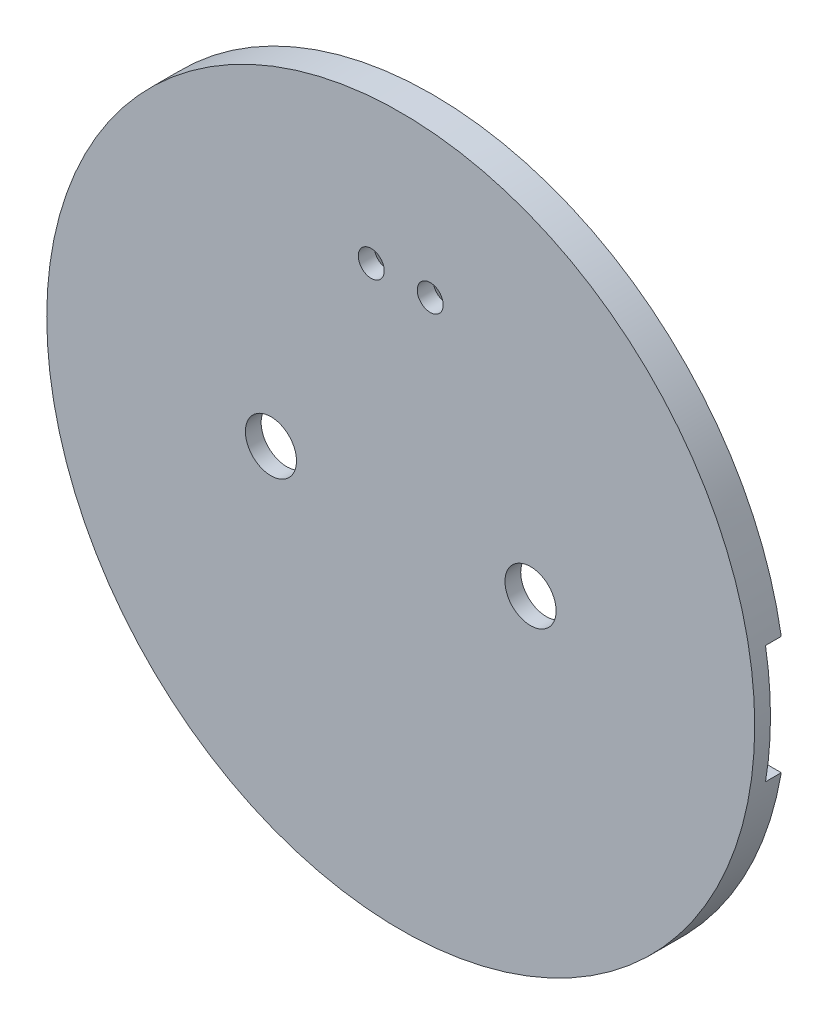
ISO-10303-21;
HEADER;
FILE_DESCRIPTION(('STEP AP214'),'2;1');
FILE_NAME('part.step','',(''),(''),'','','');
FILE_SCHEMA(('AUTOMOTIVE_DESIGN { 1 0 10303 214 1 1 1 1 }'));
ENDSEC;
DATA;
#1=APPLICATION_CONTEXT('core data for automotive mechanical design processes');
#2=APPLICATION_PROTOCOL_DEFINITION('international standard','automotive_design',2000,#1);
#3=PRODUCT_CONTEXT('',#1,'mechanical');
#4=PRODUCT('Part','Part','',(#3));
#5=PRODUCT_RELATED_PRODUCT_CATEGORY('part','',(#4));
#6=PRODUCT_DEFINITION_FORMATION('','',#4);
#7=PRODUCT_DEFINITION_CONTEXT('part definition',#1,'design');
#8=PRODUCT_DEFINITION('design','',#6,#7);
#9=PRODUCT_DEFINITION_SHAPE('','',#8);
#10=(LENGTH_UNIT() NAMED_UNIT(*) SI_UNIT(.MILLI.,.METRE.));
#11=(NAMED_UNIT(*) PLANE_ANGLE_UNIT() SI_UNIT($,.RADIAN.));
#12=(NAMED_UNIT(*) SI_UNIT($,.STERADIAN.) SOLID_ANGLE_UNIT());
#13=UNCERTAINTY_MEASURE_WITH_UNIT(LENGTH_MEASURE(1.E-05),#10,'distance_accuracy_value','');
#14=(GEOMETRIC_REPRESENTATION_CONTEXT(3) GLOBAL_UNCERTAINTY_ASSIGNED_CONTEXT((#13)) GLOBAL_UNIT_ASSIGNED_CONTEXT((#10,
#11,#12)) REPRESENTATION_CONTEXT('',''));
#15=CARTESIAN_POINT('',(0.,0.,0.));
#16=DIRECTION('',(0.,0.,1.));
#17=DIRECTION('',(1.,0.,0.));
#18=AXIS2_PLACEMENT_3D('',#15,#16,#17);
#19=CARTESIAN_POINT('',(0.,0.,0.));
#20=DIRECTION('',(0.,0.,1.));
#21=DIRECTION('',(1.,0.,0.));
#22=AXIS2_PLACEMENT_3D('',#19,#20,#21);
#23=PLANE('',#22);
#24=CARTESIAN_POINT('',(-7.49999999999285,52.9999999999995,0.));
#25=DIRECTION('',(0.,0.,-1.));
#26=DIRECTION('',(-1.,0.,0.));
#27=AXIS2_PLACEMENT_3D('',#24,#25,#26);
#28=CIRCLE('',#27,3.3);
#29=CARTESIAN_POINT('',(-10.7999999999929,52.9999999999995,0.));
#30=VERTEX_POINT('',#29);
#31=EDGE_CURVE('E180',#30,#30,#28,.T.);
#32=ORIENTED_EDGE('',*,*,#31,.T.);
#33=EDGE_LOOP('',(#32));
#34=FACE_BOUND('',#33,.T.);
#35=CARTESIAN_POINT('',(0.,0.,0.));
#36=DIRECTION('',(0.,0.,1.));
#37=DIRECTION('',(1.,0.,0.));
#38=AXIS2_PLACEMENT_3D('',#35,#36,#37);
#39=CIRCLE('',#38,90.);
#40=CARTESIAN_POINT('',(90.,0.,0.));
#41=VERTEX_POINT('',#40);
#42=EDGE_CURVE('E50',#41,#41,#39,.T.);
#43=ORIENTED_EDGE('',*,*,#42,.T.);
#44=EDGE_LOOP('',(#43));
#45=FACE_BOUND('',#44,.T.);
#46=CARTESIAN_POINT('',(32.9999999999839,-3.78169717762944E-11,0.));
#47=DIRECTION('',(0.,0.,-1.));
#48=DIRECTION('',(-1.,0.,0.));
#49=AXIS2_PLACEMENT_3D('',#46,#47,#48);
#50=CIRCLE('',#49,6.50000000001092);
#51=CARTESIAN_POINT('',(26.499999999973,-3.78169717762944E-11,0.));
#52=VERTEX_POINT('',#51);
#53=EDGE_CURVE('E191',#52,#52,#50,.T.);
#54=ORIENTED_EDGE('',*,*,#53,.T.);
#55=EDGE_LOOP('',(#54));
#56=FACE_BOUND('',#55,.T.);
#57=CARTESIAN_POINT('',(-33.0000000000161,-3.78308495641022E-11,0.));
#58=DIRECTION('',(0.,0.,-1.));
#59=DIRECTION('',(-1.,0.,0.));
#60=AXIS2_PLACEMENT_3D('',#57,#58,#59);
#61=CIRCLE('',#60,6.50000000001084);
#62=CARTESIAN_POINT('',(-39.500000000027,-3.78308495641022E-11,0.));
#63=VERTEX_POINT('',#62);
#64=EDGE_CURVE('E115',#63,#63,#61,.T.);
#65=ORIENTED_EDGE('',*,*,#64,.T.);
#66=EDGE_LOOP('',(#65));
#67=FACE_BOUND('',#66,.T.);
#68=CARTESIAN_POINT('',(7.50000000000715,52.9999999999995,0.));
#69=DIRECTION('',(0.,0.,-1.));
#70=DIRECTION('',(-1.,0.,0.));
#71=AXIS2_PLACEMENT_3D('',#68,#69,#70);
#72=CIRCLE('',#71,3.3);
#73=CARTESIAN_POINT('',(4.20000000000715,52.9999999999995,0.));
#74=VERTEX_POINT('',#73);
#75=EDGE_CURVE('E186',#74,#74,#72,.T.);
#76=ORIENTED_EDGE('',*,*,#75,.T.);
#77=EDGE_LOOP('',(#76));
#78=FACE_BOUND('',#77,.T.);
#79=ADVANCED_FACE('F43',(#34,#45,#56,#67,#78),#23,.T.);
#80=CARTESIAN_POINT('',(0.,0.,-8.));
#81=DIRECTION('',(0.,0.,1.));
#82=DIRECTION('',(1.,0.,0.));
#83=AXIS2_PLACEMENT_3D('',#80,#81,#82);
#84=PLANE('',#83);
#85=CARTESIAN_POINT('',(0.,0.,-8.));
#86=DIRECTION('',(0.,0.,1.));
#87=DIRECTION('',(1.,0.,0.));
#88=AXIS2_PLACEMENT_3D('',#85,#86,#87);
#89=CIRCLE('',#88,90.);
#90=CARTESIAN_POINT('',(-88.7411967464943,-15.,-8.));
#91=VERTEX_POINT('',#90);
#92=CARTESIAN_POINT('',(88.7411967464943,-15.,-8.));
#93=VERTEX_POINT('',#92);
#94=EDGE_CURVE('E55',#91,#93,#89,.T.);
#95=ORIENTED_EDGE('',*,*,#94,.F.);
#96=DIRECTION('',(-1.,0.,0.));
#97=VECTOR('',#96,1.);
#98=CARTESIAN_POINT('',(88.7411967464943,-15.,-8.));
#99=LINE('',#98,#97);
#100=EDGE_CURVE('E82',#93,#91,#99,.T.);
#101=ORIENTED_EDGE('',*,*,#100,.F.);
#102=EDGE_LOOP('',(#95,#101));
#103=FACE_BOUND('',#102,.T.);
#104=ADVANCED_FACE('F117',(#103),#84,.F.);
#105=CARTESIAN_POINT('',(0.,0.,-8.));
#106=DIRECTION('',(0.,0.,1.));
#107=DIRECTION('',(1.,0.,0.));
#108=AXIS2_PLACEMENT_3D('',#105,#106,#107);
#109=CYLINDRICAL_SURFACE('',#108,90.);
#110=DIRECTION('',(0.,0.,-1.));
#111=VECTOR('',#110,1.);
#112=CARTESIAN_POINT('',(-88.7411967464943,-15.,-4.));
#113=LINE('',#112,#111);
#114=CARTESIAN_POINT('',(-88.7411967464943,-15.,-4.));
#115=VERTEX_POINT('',#114);
#116=EDGE_CURVE('E70',#115,#91,#113,.T.);
#117=ORIENTED_EDGE('',*,*,#116,.T.);
#118=ORIENTED_EDGE('',*,*,#94,.T.);
#119=DIRECTION('',(0.,0.,-1.));
#120=VECTOR('',#119,1.);
#121=CARTESIAN_POINT('',(88.7411967464943,-15.,-4.));
#122=LINE('',#121,#120);
#123=CARTESIAN_POINT('',(88.7411967464943,-15.,-4.));
#124=VERTEX_POINT('',#123);
#125=EDGE_CURVE('E92',#124,#93,#122,.T.);
#126=ORIENTED_EDGE('',*,*,#125,.F.);
#127=CARTESIAN_POINT('',(0.,0.,-4.));
#128=DIRECTION('',(0.,0.,-1.));
#129=DIRECTION('',(-1.,0.,0.));
#130=AXIS2_PLACEMENT_3D('',#127,#128,#129);
#131=CIRCLE('',#130,90.);
#132=CARTESIAN_POINT('',(88.7411967464943,15.,-4.));
#133=VERTEX_POINT('',#132);
#134=EDGE_CURVE('E97',#133,#124,#131,.T.);
#135=ORIENTED_EDGE('',*,*,#134,.F.);
#136=DIRECTION('',(0.,0.,-1.));
#137=VECTOR('',#136,1.);
#138=CARTESIAN_POINT('',(88.7411967464943,15.,-4.));
#139=LINE('',#138,#137);
#140=CARTESIAN_POINT('',(88.7411967464943,15.,-8.));
#141=VERTEX_POINT('',#140);
#142=EDGE_CURVE('E90',#133,#141,#139,.T.);
#143=ORIENTED_EDGE('',*,*,#142,.T.);
#144=CARTESIAN_POINT('',(-88.7411967464943,15.,-8.));
#145=VERTEX_POINT('',#144);
#146=EDGE_CURVE('E12',#141,#145,#89,.T.);
#147=ORIENTED_EDGE('',*,*,#146,.T.);
#148=DIRECTION('',(0.,0.,-1.));
#149=VECTOR('',#148,1.);
#150=CARTESIAN_POINT('',(-88.7411967464943,15.,-4.));
#151=LINE('',#150,#149);
#152=CARTESIAN_POINT('',(-88.7411967464943,15.,-4.));
#153=VERTEX_POINT('',#152);
#154=EDGE_CURVE('E56',#153,#145,#151,.T.);
#155=ORIENTED_EDGE('',*,*,#154,.F.);
#156=CARTESIAN_POINT('',(0.,0.,-4.));
#157=DIRECTION('',(0.,0.,-1.));
#158=DIRECTION('',(1.,0.,0.));
#159=AXIS2_PLACEMENT_3D('',#156,#157,#158);
#160=CIRCLE('',#159,90.);
#161=EDGE_CURVE('E101',#115,#153,#160,.T.);
#162=ORIENTED_EDGE('',*,*,#161,.F.);
#163=EDGE_LOOP('',(#117,#118,#126,#135,#143,#147,#155,#162));
#164=FACE_BOUND('',#163,.T.);
#165=ORIENTED_EDGE('',*,*,#42,.F.);
#166=EDGE_LOOP('',(#165));
#167=FACE_BOUND('',#166,.T.);
#168=ADVANCED_FACE('F44',(#164,#167),#109,.T.);
#169=CARTESIAN_POINT('',(-7.49999999999285,52.9999999999995,-8.));
#170=DIRECTION('',(0.,0.,-1.));
#171=DIRECTION('',(-1.,0.,0.));
#172=AXIS2_PLACEMENT_3D('',#169,#170,#171);
#173=CIRCLE('',#172,7.22);
#174=CARTESIAN_POINT('',(-14.7199999999929,52.9999999999995,-8.));
#175=VERTEX_POINT('',#174);
#176=EDGE_CURVE('E177',#175,#175,#173,.T.);
#177=ORIENTED_EDGE('',*,*,#176,.F.);
#178=EDGE_LOOP('',(#177));
#179=FACE_BOUND('',#178,.T.);
#180=CARTESIAN_POINT('',(7.50000000000715,52.9999999999995,-8.));
#181=DIRECTION('',(0.,0.,-1.));
#182=DIRECTION('',(-1.,0.,0.));
#183=AXIS2_PLACEMENT_3D('',#180,#181,#182);
#184=CIRCLE('',#183,7.22);
#185=CARTESIAN_POINT('',(0.28000000000715,52.9999999999995,-8.));
#186=VERTEX_POINT('',#185);
#187=EDGE_CURVE('E185',#186,#186,#184,.T.);
#188=ORIENTED_EDGE('',*,*,#187,.F.);
#189=EDGE_LOOP('',(#188));
#190=FACE_BOUND('',#189,.T.);
#191=ORIENTED_EDGE('',*,*,#146,.F.);
#192=DIRECTION('',(1.,0.,0.));
#193=VECTOR('',#192,1.);
#194=CARTESIAN_POINT('',(88.7411967464943,15.,-8.));
#195=LINE('',#194,#193);
#196=EDGE_CURVE('E93',#145,#141,#195,.T.);
#197=ORIENTED_EDGE('',*,*,#196,.F.);
#198=EDGE_LOOP('',(#191,#197));
#199=FACE_BOUND('',#198,.T.);
#200=ADVANCED_FACE('F123',(#179,#190,#199),#84,.F.);
#201=CARTESIAN_POINT('',(88.7411967464943,-15.,-4.));
#202=DIRECTION('',(0.,-1.,0.));
#203=DIRECTION('',(0.,0.,-1.));
#204=AXIS2_PLACEMENT_3D('',#201,#202,#203);
#205=PLANE('',#204);
#206=ORIENTED_EDGE('',*,*,#100,.T.);
#207=ORIENTED_EDGE('',*,*,#116,.F.);
#208=DIRECTION('',(-1.,0.,0.));
#209=VECTOR('',#208,1.);
#210=CARTESIAN_POINT('',(88.7411967464943,-15.,-4.));
#211=LINE('',#210,#209);
#212=EDGE_CURVE('E106',#124,#115,#211,.T.);
#213=ORIENTED_EDGE('',*,*,#212,.F.);
#214=ORIENTED_EDGE('',*,*,#125,.T.);
#215=EDGE_LOOP('',(#206,#207,#213,#214));
#216=FACE_BOUND('',#215,.T.);
#217=ADVANCED_FACE('F118',(#216),#205,.F.);
#218=CARTESIAN_POINT('',(88.7411967464943,15.,-4.));
#219=DIRECTION('',(0.,1.,0.));
#220=DIRECTION('',(0.,0.,1.));
#221=AXIS2_PLACEMENT_3D('',#218,#219,#220);
#222=PLANE('',#221);
#223=ORIENTED_EDGE('',*,*,#196,.T.);
#224=ORIENTED_EDGE('',*,*,#142,.F.);
#225=DIRECTION('',(1.,0.,0.));
#226=VECTOR('',#225,1.);
#227=CARTESIAN_POINT('',(88.7411967464943,15.,-4.));
#228=LINE('',#227,#226);
#229=EDGE_CURVE('E88',#153,#133,#228,.T.);
#230=ORIENTED_EDGE('',*,*,#229,.F.);
#231=ORIENTED_EDGE('',*,*,#154,.T.);
#232=EDGE_LOOP('',(#223,#224,#230,#231));
#233=FACE_BOUND('',#232,.T.);
#234=ADVANCED_FACE('F89',(#233),#222,.F.);
#235=CARTESIAN_POINT('',(0.,0.,-4.));
#236=DIRECTION('',(0.,0.,1.));
#237=DIRECTION('',(1.,0.,0.));
#238=AXIS2_PLACEMENT_3D('',#235,#236,#237);
#239=PLANE('',#238);
#240=CARTESIAN_POINT('',(-33.0000000000161,-3.78308495641022E-11,-4.));
#241=DIRECTION('',(0.,0.,-1.));
#242=DIRECTION('',(-1.,0.,0.));
#243=AXIS2_PLACEMENT_3D('',#240,#241,#242);
#244=CIRCLE('',#243,6.50000000001084);
#245=CARTESIAN_POINT('',(-39.500000000027,-3.78308495641022E-11,-4.));
#246=VERTEX_POINT('',#245);
#247=EDGE_CURVE('E193',#246,#246,#244,.T.);
#248=ORIENTED_EDGE('',*,*,#247,.F.);
#249=EDGE_LOOP('',(#248));
#250=FACE_BOUND('',#249,.T.);
#251=CARTESIAN_POINT('',(32.9999999999839,-3.78169717762944E-11,-4.));
#252=DIRECTION('',(0.,0.,-1.));
#253=DIRECTION('',(-1.,0.,0.));
#254=AXIS2_PLACEMENT_3D('',#251,#252,#253);
#255=CIRCLE('',#254,6.50000000001092);
#256=CARTESIAN_POINT('',(26.499999999973,-3.78169717762944E-11,-4.));
#257=VERTEX_POINT('',#256);
#258=EDGE_CURVE('E197',#257,#257,#255,.T.);
#259=ORIENTED_EDGE('',*,*,#258,.F.);
#260=EDGE_LOOP('',(#259));
#261=FACE_BOUND('',#260,.T.);
#262=ORIENTED_EDGE('',*,*,#161,.T.);
#263=ORIENTED_EDGE('',*,*,#229,.T.);
#264=ORIENTED_EDGE('',*,*,#134,.T.);
#265=ORIENTED_EDGE('',*,*,#212,.T.);
#266=EDGE_LOOP('',(#262,#263,#264,#265));
#267=FACE_BOUND('',#266,.T.);
#268=ADVANCED_FACE('F98',(#250,#261,#267),#239,.F.);
#269=CARTESIAN_POINT('',(32.9999999999839,-3.78169717762944E-11,0.));
#270=DIRECTION('',(0.,0.,-1.));
#271=DIRECTION('',(-1.,0.,0.));
#272=AXIS2_PLACEMENT_3D('',#269,#270,#271);
#273=CYLINDRICAL_SURFACE('',#272,6.50000000001092);
#274=ORIENTED_EDGE('',*,*,#53,.F.);
#275=EDGE_LOOP('',(#274));
#276=FACE_BOUND('',#275,.T.);
#277=ORIENTED_EDGE('',*,*,#258,.T.);
#278=EDGE_LOOP('',(#277));
#279=FACE_BOUND('',#278,.T.);
#280=ADVANCED_FACE('F144',(#276,#279),#273,.F.);
#281=CARTESIAN_POINT('',(-33.0000000000161,-3.78308495641022E-11,0.));
#282=DIRECTION('',(0.,0.,-1.));
#283=DIRECTION('',(-1.,0.,0.));
#284=AXIS2_PLACEMENT_3D('',#281,#282,#283);
#285=CYLINDRICAL_SURFACE('',#284,6.50000000001084);
#286=ORIENTED_EDGE('',*,*,#64,.F.);
#287=EDGE_LOOP('',(#286));
#288=FACE_BOUND('',#287,.T.);
#289=ORIENTED_EDGE('',*,*,#247,.T.);
#290=EDGE_LOOP('',(#289));
#291=FACE_BOUND('',#290,.T.);
#292=ADVANCED_FACE('F149',(#288,#291),#285,.F.);
#293=CARTESIAN_POINT('',(7.50000000000715,52.9999999999995,-8.));
#294=DIRECTION('',(0.,0.,-1.));
#295=DIRECTION('',(-1.,0.,0.));
#296=AXIS2_PLACEMENT_3D('',#293,#294,#295);
#297=CYLINDRICAL_SURFACE('',#296,3.29999999999999);
#298=ORIENTED_EDGE('',*,*,#75,.F.);
#299=EDGE_LOOP('',(#298));
#300=FACE_BOUND('',#299,.T.);
#301=CARTESIAN_POINT('',(7.50000000000715,52.9999999999995,-4.07999999999998));
#302=DIRECTION('',(0.,0.,-1.));
#303=DIRECTION('',(-1.,0.,0.));
#304=AXIS2_PLACEMENT_3D('',#301,#302,#303);
#305=CIRCLE('',#304,3.29999999999999);
#306=CARTESIAN_POINT('',(4.20000000000716,52.9999999999995,-4.07999999999998));
#307=VERTEX_POINT('',#306);
#308=EDGE_CURVE('E183',#307,#307,#305,.T.);
#309=ORIENTED_EDGE('',*,*,#308,.T.);
#310=EDGE_LOOP('',(#309));
#311=FACE_BOUND('',#310,.T.);
#312=ADVANCED_FACE('F155',(#300,#311),#297,.F.);
#313=CARTESIAN_POINT('',(7.50000000000715,52.9999999999995,-8.));
#314=DIRECTION('',(0.,0.,-1.));
#315=DIRECTION('',(-1.,0.,0.));
#316=AXIS2_PLACEMENT_3D('',#313,#314,#315);
#317=CONICAL_SURFACE('',#316,7.22,0.785398163397447);
#318=ORIENTED_EDGE('',*,*,#308,.F.);
#319=EDGE_LOOP('',(#318));
#320=FACE_BOUND('',#319,.T.);
#321=ORIENTED_EDGE('',*,*,#187,.T.);
#322=EDGE_LOOP('',(#321));
#323=FACE_BOUND('',#322,.T.);
#324=ADVANCED_FACE('F156',(#320,#323),#317,.F.);
#325=CARTESIAN_POINT('',(-7.49999999999285,52.9999999999995,-8.));
#326=DIRECTION('',(0.,0.,-1.));
#327=DIRECTION('',(-1.,0.,0.));
#328=AXIS2_PLACEMENT_3D('',#325,#326,#327);
#329=CYLINDRICAL_SURFACE('',#328,3.29999999999999);
#330=ORIENTED_EDGE('',*,*,#31,.F.);
#331=EDGE_LOOP('',(#330));
#332=FACE_BOUND('',#331,.T.);
#333=CARTESIAN_POINT('',(-7.49999999999285,52.9999999999995,-4.07999999999998));
#334=DIRECTION('',(0.,0.,-1.));
#335=DIRECTION('',(-1.,0.,0.));
#336=AXIS2_PLACEMENT_3D('',#333,#334,#335);
#337=CIRCLE('',#336,3.29999999999999);
#338=CARTESIAN_POINT('',(-10.7999999999928,52.9999999999995,-4.07999999999998));
#339=VERTEX_POINT('',#338);
#340=EDGE_CURVE('E171',#339,#339,#337,.T.);
#341=ORIENTED_EDGE('',*,*,#340,.T.);
#342=EDGE_LOOP('',(#341));
#343=FACE_BOUND('',#342,.T.);
#344=ADVANCED_FACE('F159',(#332,#343),#329,.F.);
#345=CARTESIAN_POINT('',(-7.49999999999285,52.9999999999995,-8.));
#346=DIRECTION('',(0.,0.,-1.));
#347=DIRECTION('',(-1.,0.,0.));
#348=AXIS2_PLACEMENT_3D('',#345,#346,#347);
#349=CONICAL_SURFACE('',#348,7.22,0.785398163397447);
#350=ORIENTED_EDGE('',*,*,#340,.F.);
#351=EDGE_LOOP('',(#350));
#352=FACE_BOUND('',#351,.T.);
#353=ORIENTED_EDGE('',*,*,#176,.T.);
#354=EDGE_LOOP('',(#353));
#355=FACE_BOUND('',#354,.T.);
#356=ADVANCED_FACE('F163',(#352,#355),#349,.F.);
#357=CLOSED_SHELL('',(#79,#104,#168,#200,#217,#234,#268,#280,#292,#312,#324,#344,#356));
#358=MANIFOLD_SOLID_BREP('B2',#357);
#359=ADVANCED_BREP_SHAPE_REPRESENTATION('',(#18,#358),#14);
#360=SHAPE_DEFINITION_REPRESENTATION(#9,#359);
ENDSEC;
END-ISO-10303-21;
